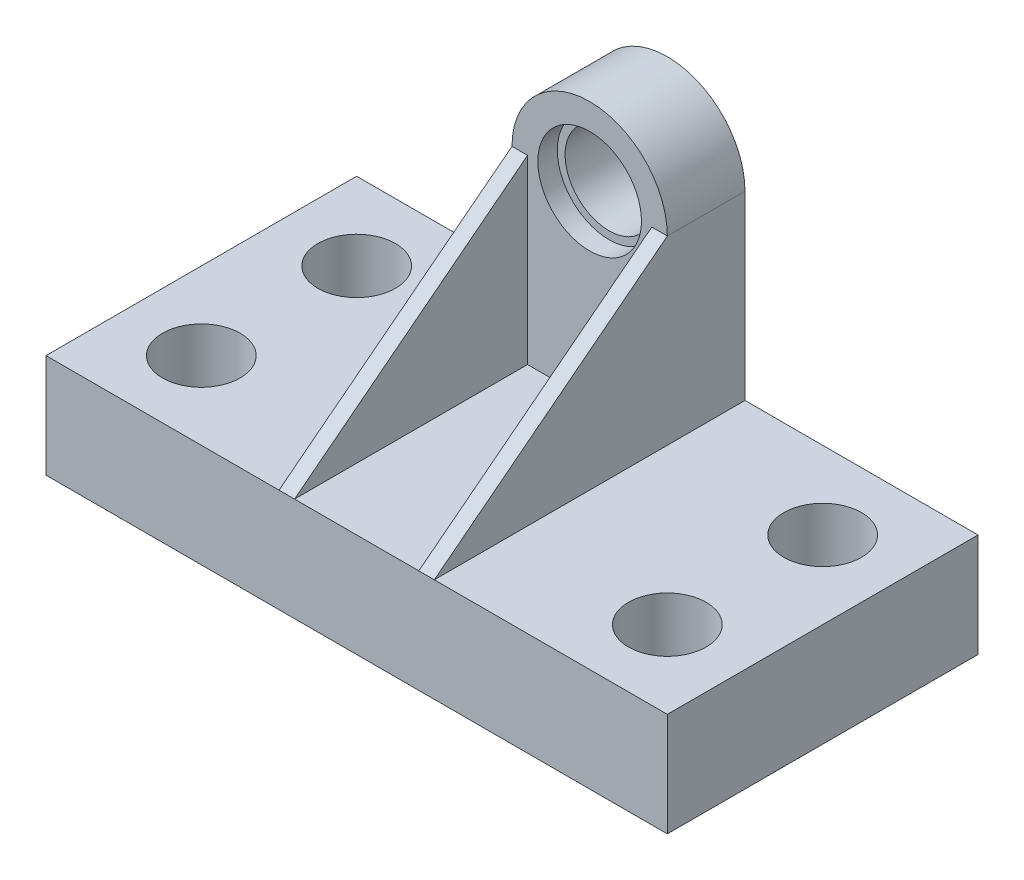
ISO-10303-21;
HEADER;
FILE_DESCRIPTION(('STEP AP214'),'2;1');
FILE_NAME('part.step','',(''),(''),'','','');
FILE_SCHEMA(('AUTOMOTIVE_DESIGN { 1 0 10303 214 1 1 1 1 }'));
ENDSEC;
DATA;
#1=APPLICATION_CONTEXT('core data for automotive mechanical design processes');
#2=APPLICATION_PROTOCOL_DEFINITION('international standard','automotive_design',2000,#1);
#3=PRODUCT_CONTEXT('',#1,'mechanical');
#4=PRODUCT('Part','Part','',(#3));
#5=PRODUCT_RELATED_PRODUCT_CATEGORY('part','',(#4));
#6=PRODUCT_DEFINITION_FORMATION('','',#4);
#7=PRODUCT_DEFINITION_CONTEXT('part definition',#1,'design');
#8=PRODUCT_DEFINITION('design','',#6,#7);
#9=PRODUCT_DEFINITION_SHAPE('','',#8);
#10=(LENGTH_UNIT() NAMED_UNIT(*) SI_UNIT(.MILLI.,.METRE.));
#11=(NAMED_UNIT(*) PLANE_ANGLE_UNIT() SI_UNIT($,.RADIAN.));
#12=(NAMED_UNIT(*) SI_UNIT($,.STERADIAN.) SOLID_ANGLE_UNIT());
#13=UNCERTAINTY_MEASURE_WITH_UNIT(LENGTH_MEASURE(1.E-05),#10,'distance_accuracy_value','');
#14=(GEOMETRIC_REPRESENTATION_CONTEXT(3) GLOBAL_UNCERTAINTY_ASSIGNED_CONTEXT((#13)) GLOBAL_UNIT_ASSIGNED_CONTEXT((#10,
#11,#12)) REPRESENTATION_CONTEXT('',''));
#15=CARTESIAN_POINT('',(0.,0.,0.));
#16=DIRECTION('',(0.,0.,1.));
#17=DIRECTION('',(1.,0.,0.));
#18=AXIS2_PLACEMENT_3D('',#15,#16,#17);
#19=CARTESIAN_POINT('',(0.,-533.4,0.));
#20=DIRECTION('',(0.,1.,0.));
#21=DIRECTION('',(0.,0.,1.));
#22=AXIS2_PLACEMENT_3D('',#19,#20,#21);
#23=PLANE('',#22);
#24=DIRECTION('',(1.,0.,0.));
#25=VECTOR('',#24,1.);
#26=CARTESIAN_POINT('',(-228.6,-533.4,228.6));
#27=LINE('',#26,#25);
#28=CARTESIAN_POINT('',(-182.88,-533.4,228.6));
#29=VERTEX_POINT('',#28);
#30=CARTESIAN_POINT('',(182.88,-533.4,228.6));
#31=VERTEX_POINT('',#30);
#32=EDGE_CURVE('E148',#29,#31,#27,.T.);
#33=ORIENTED_EDGE('',*,*,#32,.F.);
#34=DIRECTION('',(0.,0.,1.));
#35=VECTOR('',#34,1.);
#36=CARTESIAN_POINT('',(-182.88,-533.4,0.));
#37=LINE('',#36,#35);
#38=CARTESIAN_POINT('',(-182.88,-533.4,914.4));
#39=VERTEX_POINT('',#38);
#40=EDGE_CURVE('E131',#29,#39,#37,.T.);
#41=ORIENTED_EDGE('',*,*,#40,.T.);
#42=DIRECTION('',(-1.,0.,0.));
#43=VECTOR('',#42,1.);
#44=CARTESIAN_POINT('',(-914.4,-533.4,914.4));
#45=LINE('',#44,#43);
#46=CARTESIAN_POINT('',(182.88,-533.4,914.4));
#47=VERTEX_POINT('',#46);
#48=EDGE_CURVE('E272',#47,#39,#45,.T.);
#49=ORIENTED_EDGE('',*,*,#48,.F.);
#50=DIRECTION('',(0.,0.,-1.));
#51=VECTOR('',#50,1.);
#52=CARTESIAN_POINT('',(182.88,-533.4,0.));
#53=LINE('',#52,#51);
#54=EDGE_CURVE('E290',#47,#31,#53,.T.);
#55=ORIENTED_EDGE('',*,*,#54,.T.);
#56=EDGE_LOOP('',(#33,#41,#49,#55));
#57=FACE_BOUND('',#56,.T.);
#58=ADVANCED_FACE('F37',(#57),#23,.T.);
#59=CARTESIAN_POINT('',(0.,0.,228.6));
#60=DIRECTION('',(0.,0.,1.));
#61=DIRECTION('',(1.,0.,0.));
#62=AXIS2_PLACEMENT_3D('',#59,#60,#61);
#63=PLANE('',#62);
#64=DIRECTION('',(-1.,0.,0.));
#65=VECTOR('',#64,1.);
#66=CARTESIAN_POINT('',(-228.6,0.,228.6));
#67=LINE('',#66,#65);
#68=CARTESIAN_POINT('',(-182.88,0.,228.6));
#69=VERTEX_POINT('',#68);
#70=CARTESIAN_POINT('',(-228.6,0.,228.6));
#71=VERTEX_POINT('',#70);
#72=EDGE_CURVE('E122',#69,#71,#67,.T.);
#73=ORIENTED_EDGE('',*,*,#72,.F.);
#74=DIRECTION('',(0.,-1.,0.));
#75=VECTOR('',#74,1.);
#76=CARTESIAN_POINT('',(-182.88,-304.8,228.6));
#77=LINE('',#76,#75);
#78=EDGE_CURVE('E136',#29,#69,#77,.F.);
#79=ORIENTED_EDGE('',*,*,#78,.F.);
#80=ORIENTED_EDGE('',*,*,#32,.T.);
#81=DIRECTION('',(0.,1.,0.));
#82=VECTOR('',#81,1.);
#83=CARTESIAN_POINT('',(182.88,-304.8,228.6));
#84=LINE('',#83,#82);
#85=CARTESIAN_POINT('',(182.88,0.,228.6));
#86=VERTEX_POINT('',#85);
#87=EDGE_CURVE('E273',#31,#86,#84,.T.);
#88=ORIENTED_EDGE('',*,*,#87,.T.);
#89=DIRECTION('',(1.,0.,0.));
#90=VECTOR('',#89,1.);
#91=CARTESIAN_POINT('',(228.6,0.,228.6));
#92=LINE('',#91,#90);
#93=CARTESIAN_POINT('',(228.6,0.,228.6));
#94=VERTEX_POINT('',#93);
#95=EDGE_CURVE('E144',#86,#94,#92,.T.);
#96=ORIENTED_EDGE('',*,*,#95,.T.);
#97=CARTESIAN_POINT('',(0.,0.,228.6));
#98=DIRECTION('',(0.,0.,1.));
#99=DIRECTION('',(1.,0.,0.));
#100=AXIS2_PLACEMENT_3D('',#97,#98,#99);
#101=CIRCLE('',#100,228.6);
#102=EDGE_CURVE('E140',#94,#71,#101,.T.);
#103=ORIENTED_EDGE('',*,*,#102,.T.);
#104=EDGE_LOOP('',(#73,#79,#80,#88,#96,#103));
#105=FACE_BOUND('',#104,.T.);
#106=CARTESIAN_POINT('',(0.,0.,228.6));
#107=DIRECTION('',(0.,0.,1.));
#108=DIRECTION('',(1.,0.,0.));
#109=AXIS2_PLACEMENT_3D('',#106,#107,#108);
#110=CIRCLE('',#109,152.4);
#111=CARTESIAN_POINT('',(-152.4,0.,228.6));
#112=VERTEX_POINT('',#111);
#113=EDGE_CURVE('E41',#112,#112,#110,.F.);
#114=ORIENTED_EDGE('',*,*,#113,.T.);
#115=EDGE_LOOP('',(#114));
#116=FACE_BOUND('',#115,.T.);
#117=ADVANCED_FACE('F141',(#105,#116),#63,.T.);
#118=CARTESIAN_POINT('',(-685.8,-533.4,228.6));
#119=DIRECTION('',(0.,1.,0.));
#120=DIRECTION('',(0.,0.,1.));
#121=AXIS2_PLACEMENT_3D('',#118,#119,#120);
#122=CIRCLE('',#121,114.3);
#123=CARTESIAN_POINT('',(-685.8,-533.4,342.9));
#124=VERTEX_POINT('',#123);
#125=EDGE_CURVE('E309',#124,#124,#122,.T.);
#126=ORIENTED_EDGE('',*,*,#125,.F.);
#127=EDGE_LOOP('',(#126));
#128=FACE_BOUND('',#127,.T.);
#129=CARTESIAN_POINT('',(-685.8,-533.4,685.800000000001));
#130=DIRECTION('',(0.,1.,0.));
#131=DIRECTION('',(0.,0.,1.));
#132=AXIS2_PLACEMENT_3D('',#129,#130,#131);
#133=CIRCLE('',#132,114.3);
#134=CARTESIAN_POINT('',(-685.8,-533.4,800.100000000001));
#135=VERTEX_POINT('',#134);
#136=EDGE_CURVE('E302',#135,#135,#133,.T.);
#137=ORIENTED_EDGE('',*,*,#136,.F.);
#138=EDGE_LOOP('',(#137));
#139=FACE_BOUND('',#138,.T.);
#140=CARTESIAN_POINT('',(-228.6,-533.4,914.4));
#141=VERTEX_POINT('',#140);
#142=CARTESIAN_POINT('',(-914.4,-533.4,914.4));
#143=VERTEX_POINT('',#142);
#144=EDGE_CURVE('E173',#141,#143,#45,.T.);
#145=ORIENTED_EDGE('',*,*,#144,.F.);
#146=DIRECTION('',(0.,0.,-1.));
#147=VECTOR('',#146,1.);
#148=CARTESIAN_POINT('',(-228.6,-533.4,228.6));
#149=LINE('',#148,#147);
#150=CARTESIAN_POINT('',(-228.6,-533.4,1.25979416228288E-13));
#151=VERTEX_POINT('',#150);
#152=EDGE_CURVE('E46',#141,#151,#149,.T.);
#153=ORIENTED_EDGE('',*,*,#152,.T.);
#154=DIRECTION('',(1.,0.,0.));
#155=VECTOR('',#154,1.);
#156=CARTESIAN_POINT('',(-914.4,-533.4,0.));
#157=LINE('',#156,#155);
#158=CARTESIAN_POINT('',(-914.4,-533.4,0.));
#159=VERTEX_POINT('',#158);
#160=EDGE_CURVE('E171',#159,#151,#157,.T.);
#161=ORIENTED_EDGE('',*,*,#160,.F.);
#162=DIRECTION('',(0.,0.,-1.));
#163=VECTOR('',#162,1.);
#164=CARTESIAN_POINT('',(-914.4,-533.4,0.));
#165=LINE('',#164,#163);
#166=EDGE_CURVE('E183',#143,#159,#165,.T.);
#167=ORIENTED_EDGE('',*,*,#166,.F.);
#168=EDGE_LOOP('',(#145,#153,#161,#167));
#169=FACE_BOUND('',#168,.T.);
#170=ADVANCED_FACE('F169',(#128,#139,#169),#23,.T.);
#171=CARTESIAN_POINT('',(0.,0.,228.6));
#172=DIRECTION('',(0.,0.,-1.));
#173=DIRECTION('',(-1.,0.,0.));
#174=AXIS2_PLACEMENT_3D('',#171,#172,#173);
#175=CYLINDRICAL_SURFACE('',#174,228.6);
#176=CARTESIAN_POINT('',(0.,0.,0.));
#177=DIRECTION('',(0.,0.,1.));
#178=DIRECTION('',(1.,0.,0.));
#179=AXIS2_PLACEMENT_3D('',#176,#177,#178);
#180=CIRCLE('',#179,228.6);
#181=CARTESIAN_POINT('',(228.6,0.,0.));
#182=VERTEX_POINT('',#181);
#183=CARTESIAN_POINT('',(-228.6,0.,0.));
#184=VERTEX_POINT('',#183);
#185=EDGE_CURVE('E152',#182,#184,#180,.T.);
#186=ORIENTED_EDGE('',*,*,#185,.T.);
#187=DIRECTION('',(0.,0.,-1.));
#188=VECTOR('',#187,1.);
#189=CARTESIAN_POINT('',(-228.6,0.,228.6));
#190=LINE('',#189,#188);
#191=EDGE_CURVE('E11',#71,#184,#190,.T.);
#192=ORIENTED_EDGE('',*,*,#191,.F.);
#193=ORIENTED_EDGE('',*,*,#102,.F.);
#194=DIRECTION('',(0.,0.,-1.));
#195=VECTOR('',#194,1.);
#196=CARTESIAN_POINT('',(228.6,0.,228.6));
#197=LINE('',#196,#195);
#198=EDGE_CURVE('E153',#94,#182,#197,.T.);
#199=ORIENTED_EDGE('',*,*,#198,.T.);
#200=EDGE_LOOP('',(#186,#192,#193,#199));
#201=FACE_BOUND('',#200,.T.);
#202=ADVANCED_FACE('F39',(#201),#175,.T.);
#203=CARTESIAN_POINT('',(-228.6,0.,228.6));
#204=DIRECTION('',(1.,0.,0.));
#205=DIRECTION('',(0.,1.,0.));
#206=AXIS2_PLACEMENT_3D('',#203,#204,#205);
#207=PLANE('',#206);
#208=DIRECTION('',(0.,-1.,0.));
#209=VECTOR('',#208,1.);
#210=CARTESIAN_POINT('',(-228.6,0.,0.));
#211=LINE('',#210,#209);
#212=EDGE_CURVE('E156',#184,#151,#211,.T.);
#213=ORIENTED_EDGE('',*,*,#212,.T.);
#214=ORIENTED_EDGE('',*,*,#152,.F.);
#215=DIRECTION('',(0.,-0.61394061351492,0.789352217376326));
#216=VECTOR('',#215,1.);
#217=CARTESIAN_POINT('',(-228.6,0.,228.6));
#218=LINE('',#217,#216);
#219=EDGE_CURVE('E124',#71,#141,#218,.T.);
#220=ORIENTED_EDGE('',*,*,#219,.F.);
#221=ORIENTED_EDGE('',*,*,#191,.T.);
#222=EDGE_LOOP('',(#213,#214,#220,#221));
#223=FACE_BOUND('',#222,.T.);
#224=ADVANCED_FACE('F133',(#223),#207,.F.);
#225=CARTESIAN_POINT('',(228.6,0.,228.6));
#226=DIRECTION('',(-1.,0.,0.));
#227=DIRECTION('',(0.,-1.,0.));
#228=AXIS2_PLACEMENT_3D('',#225,#226,#227);
#229=PLANE('',#228);
#230=DIRECTION('',(0.,1.,0.));
#231=VECTOR('',#230,1.);
#232=CARTESIAN_POINT('',(228.6,0.,0.));
#233=LINE('',#232,#231);
#234=CARTESIAN_POINT('',(228.6,-533.4,0.));
#235=VERTEX_POINT('',#234);
#236=EDGE_CURVE('E149',#235,#182,#233,.T.);
#237=ORIENTED_EDGE('',*,*,#236,.T.);
#238=ORIENTED_EDGE('',*,*,#198,.F.);
#239=DIRECTION('',(0.,-0.61394061351492,0.789352217376326));
#240=VECTOR('',#239,1.);
#241=CARTESIAN_POINT('',(228.6,0.,228.6));
#242=LINE('',#241,#240);
#243=CARTESIAN_POINT('',(228.6,-533.4,914.400000000001));
#244=VERTEX_POINT('',#243);
#245=EDGE_CURVE('E269',#94,#244,#242,.T.);
#246=ORIENTED_EDGE('',*,*,#245,.T.);
#247=DIRECTION('',(0.,0.,-1.));
#248=VECTOR('',#247,1.);
#249=CARTESIAN_POINT('',(228.6,-533.4,228.6));
#250=LINE('',#249,#248);
#251=EDGE_CURVE('E165',#244,#235,#250,.T.);
#252=ORIENTED_EDGE('',*,*,#251,.T.);
#253=EDGE_LOOP('',(#237,#238,#246,#252));
#254=FACE_BOUND('',#253,.T.);
#255=ADVANCED_FACE('F225',(#254),#229,.F.);
#256=CARTESIAN_POINT('',(0.,0.,0.));
#257=DIRECTION('',(0.,0.,1.));
#258=DIRECTION('',(1.,0.,0.));
#259=AXIS2_PLACEMENT_3D('',#256,#257,#258);
#260=PLANE('',#259);
#261=CARTESIAN_POINT('',(0.,0.,0.));
#262=DIRECTION('',(0.,0.,1.));
#263=DIRECTION('',(1.,0.,0.));
#264=AXIS2_PLACEMENT_3D('',#261,#262,#263);
#265=CIRCLE('',#264,129.54);
#266=CARTESIAN_POINT('',(129.54,0.,0.));
#267=VERTEX_POINT('',#266);
#268=EDGE_CURVE('E203',#267,#267,#265,.T.);
#269=ORIENTED_EDGE('',*,*,#268,.T.);
#270=EDGE_LOOP('',(#269));
#271=FACE_BOUND('',#270,.T.);
#272=ORIENTED_EDGE('',*,*,#185,.F.);
#273=ORIENTED_EDGE('',*,*,#236,.F.);
#274=CARTESIAN_POINT('',(914.4,-533.4,3.35945109942102E-13));
#275=VERTEX_POINT('',#274);
#276=EDGE_CURVE('E180',#235,#275,#157,.T.);
#277=ORIENTED_EDGE('',*,*,#276,.T.);
#278=DIRECTION('',(0.,1.,0.));
#279=VECTOR('',#278,1.);
#280=CARTESIAN_POINT('',(914.4,-838.2,3.35945109942102E-13));
#281=LINE('',#280,#279);
#282=CARTESIAN_POINT('',(914.4,-838.2,3.35945109942102E-13));
#283=VERTEX_POINT('',#282);
#284=EDGE_CURVE('E199',#283,#275,#281,.T.);
#285=ORIENTED_EDGE('',*,*,#284,.F.);
#286=DIRECTION('',(1.,0.,0.));
#287=VECTOR('',#286,1.);
#288=CARTESIAN_POINT('',(-914.4,-838.2,0.));
#289=LINE('',#288,#287);
#290=CARTESIAN_POINT('',(-914.4,-838.2,0.));
#291=VERTEX_POINT('',#290);
#292=EDGE_CURVE('E283',#291,#283,#289,.T.);
#293=ORIENTED_EDGE('',*,*,#292,.F.);
#294=DIRECTION('',(0.,1.,0.));
#295=VECTOR('',#294,1.);
#296=CARTESIAN_POINT('',(-914.4,-838.2,0.));
#297=LINE('',#296,#295);
#298=EDGE_CURVE('E177',#291,#159,#297,.T.);
#299=ORIENTED_EDGE('',*,*,#298,.T.);
#300=ORIENTED_EDGE('',*,*,#160,.T.);
#301=ORIENTED_EDGE('',*,*,#212,.F.);
#302=EDGE_LOOP('',(#272,#273,#277,#285,#293,#299,#300,#301));
#303=FACE_BOUND('',#302,.T.);
#304=ADVANCED_FACE('F175',(#271,#303),#260,.F.);
#305=CARTESIAN_POINT('',(0.,0.,228.600012));
#306=DIRECTION('',(0.,0.,-1.));
#307=DIRECTION('',(-1.,0.,0.));
#308=AXIS2_PLACEMENT_3D('',#305,#306,#307);
#309=CYLINDRICAL_SURFACE('',#308,152.4);
#310=CARTESIAN_POINT('',(0.,0.,171.45));
#311=DIRECTION('',(0.,0.,1.));
#312=DIRECTION('',(1.,0.,0.));
#313=AXIS2_PLACEMENT_3D('',#310,#311,#312);
#314=CIRCLE('',#313,152.4);
#315=CARTESIAN_POINT('',(-152.4,0.,171.45));
#316=VERTEX_POINT('',#315);
#317=EDGE_CURVE('E160',#316,#316,#314,.T.);
#318=CARTESIAN_POINT('',(-152.4,0.,228.6));
#319=CARTESIAN_POINT('',(-152.4,0.,228.0046875));
#320=CARTESIAN_POINT('',(-152.4,0.,227.409375));
#321=CARTESIAN_POINT('',(-152.4,0.,226.21875));
#322=CARTESIAN_POINT('',(-152.4,0.,225.6234375));
#323=CARTESIAN_POINT('',(-152.4,0.,224.4328125));
#324=CARTESIAN_POINT('',(-152.4,0.,223.8375));
#325=CARTESIAN_POINT('',(-152.4,0.,222.646875));
#326=CARTESIAN_POINT('',(-152.4,0.,222.0515625));
#327=CARTESIAN_POINT('',(-152.4,0.,220.8609375));
#328=CARTESIAN_POINT('',(-152.4,0.,220.265625));
#329=CARTESIAN_POINT('',(-152.4,0.,219.075));
#330=CARTESIAN_POINT('',(-152.4,0.,218.4796875));
#331=CARTESIAN_POINT('',(-152.4,0.,217.2890625));
#332=CARTESIAN_POINT('',(-152.4,0.,216.69375));
#333=CARTESIAN_POINT('',(-152.4,0.,215.503125));
#334=CARTESIAN_POINT('',(-152.4,0.,214.9078125));
#335=CARTESIAN_POINT('',(-152.4,0.,213.7171875));
#336=CARTESIAN_POINT('',(-152.4,0.,213.121875));
#337=CARTESIAN_POINT('',(-152.4,0.,211.93125));
#338=CARTESIAN_POINT('',(-152.4,0.,211.3359375));
#339=CARTESIAN_POINT('',(-152.4,0.,210.1453125));
#340=CARTESIAN_POINT('',(-152.4,0.,209.55));
#341=CARTESIAN_POINT('',(-152.4,0.,208.359375));
#342=CARTESIAN_POINT('',(-152.4,0.,207.7640625));
#343=CARTESIAN_POINT('',(-152.4,0.,206.5734375));
#344=CARTESIAN_POINT('',(-152.4,0.,205.978125));
#345=CARTESIAN_POINT('',(-152.4,0.,204.7875));
#346=CARTESIAN_POINT('',(-152.4,0.,204.1921875));
#347=CARTESIAN_POINT('',(-152.4,0.,203.0015625));
#348=CARTESIAN_POINT('',(-152.4,0.,202.40625));
#349=CARTESIAN_POINT('',(-152.4,0.,201.215625));
#350=CARTESIAN_POINT('',(-152.4,0.,200.6203125));
#351=CARTESIAN_POINT('',(-152.4,0.,199.4296875));
#352=CARTESIAN_POINT('',(-152.4,0.,198.834375));
#353=CARTESIAN_POINT('',(-152.4,0.,197.64375));
#354=CARTESIAN_POINT('',(-152.4,0.,197.0484375));
#355=CARTESIAN_POINT('',(-152.4,0.,195.8578125));
#356=CARTESIAN_POINT('',(-152.4,0.,195.2625));
#357=CARTESIAN_POINT('',(-152.4,0.,194.071875));
#358=CARTESIAN_POINT('',(-152.4,0.,193.4765625));
#359=CARTESIAN_POINT('',(-152.4,0.,192.2859375));
#360=CARTESIAN_POINT('',(-152.4,0.,191.690625));
#361=CARTESIAN_POINT('',(-152.4,0.,190.5));
#362=CARTESIAN_POINT('',(-152.4,0.,189.9046875));
#363=CARTESIAN_POINT('',(-152.4,0.,188.7140625));
#364=CARTESIAN_POINT('',(-152.4,0.,188.11875));
#365=CARTESIAN_POINT('',(-152.4,0.,186.928125));
#366=CARTESIAN_POINT('',(-152.4,0.,186.3328125));
#367=CARTESIAN_POINT('',(-152.4,0.,185.1421875));
#368=CARTESIAN_POINT('',(-152.4,0.,184.546875));
#369=CARTESIAN_POINT('',(-152.4,0.,183.35625));
#370=CARTESIAN_POINT('',(-152.4,0.,182.7609375));
#371=CARTESIAN_POINT('',(-152.4,0.,181.5703125));
#372=CARTESIAN_POINT('',(-152.4,0.,180.975));
#373=CARTESIAN_POINT('',(-152.4,0.,179.784375));
#374=CARTESIAN_POINT('',(-152.4,0.,179.1890625));
#375=CARTESIAN_POINT('',(-152.4,0.,177.9984375));
#376=CARTESIAN_POINT('',(-152.4,0.,177.403125));
#377=CARTESIAN_POINT('',(-152.4,0.,176.2125));
#378=CARTESIAN_POINT('',(-152.4,0.,175.6171875));
#379=CARTESIAN_POINT('',(-152.4,0.,174.4265625));
#380=CARTESIAN_POINT('',(-152.4,0.,173.83125));
#381=CARTESIAN_POINT('',(-152.4,0.,172.640625));
#382=CARTESIAN_POINT('',(-152.4,0.,172.0453125));
#383=CARTESIAN_POINT('',(-152.4,0.,171.45));
#384=B_SPLINE_CURVE_WITH_KNOTS('',3,(#318,#319,#320,#321,#322,#323,#324,#325,#326,#327,#328,
#329,#330,#331,#332,#333,#334,#335,#336,#337,#338,#339,#340,#341,#342,#343,#344,#345,#346,#347,
#348,#349,#350,#351,#352,#353,#354,#355,#356,#357,#358,#359,#360,#361,#362,#363,#364,#365,#366,
#367,#368,#369,#370,#371,#372,#373,#374,#375,#376,#377,#378,#379,#380,#381,#382,#383),
.UNSPECIFIED.,.F.,.F.,(4,2,2,2,2,2,2,2,2,2,2,2,2,2,2,2,2,2,2,2,2,2,2,2,2,2,2,2,2,2,2,2,4),(0.,
1.78593749999997,3.57187499999997,5.35781249999998,7.14374999999998,8.92968749999998,10.715625,
12.5015625,14.2875,16.0734375,17.859375,19.6453125,21.43125,23.2171875,25.003125,26.7890625,
28.575,30.3609375,32.146875,33.9328125,35.71875,37.5046875,39.290625,41.0765625,42.8625,
44.6484375,46.434375,48.2203125,50.00625,51.7921875,53.578125,55.3640625,57.15),.UNSPECIFIED.);
#385=EDGE_CURVE('BSEAM214',#112,#316,#384,.T.);
#386=ORIENTED_EDGE('',*,*,#113,.F.);
#387=ORIENTED_EDGE('',*,*,#317,.F.);
#388=ORIENTED_EDGE('',*,*,#385,.T.);
#389=ORIENTED_EDGE('',*,*,#385,.F.);
#390=EDGE_LOOP('',(#386,#388,#387,#389));
#391=FACE_BOUND('',#390,.T.);
#392=ADVANCED_FACE('F214',(#391),#309,.F.);
#393=CARTESIAN_POINT('',(0.,0.,171.45));
#394=DIRECTION('',(0.,0.,1.));
#395=DIRECTION('',(1.,0.,0.));
#396=AXIS2_PLACEMENT_3D('',#393,#394,#395);
#397=PLANE('',#396);
#398=CARTESIAN_POINT('',(0.,0.,171.45));
#399=DIRECTION('',(0.,0.,1.));
#400=DIRECTION('',(1.,0.,0.));
#401=AXIS2_PLACEMENT_3D('',#398,#399,#400);
#402=CIRCLE('',#401,129.54);
#403=CARTESIAN_POINT('',(129.54,0.,171.45));
#404=VERTEX_POINT('',#403);
#405=EDGE_CURVE('E206',#404,#404,#402,.T.);
#406=ORIENTED_EDGE('',*,*,#405,.F.);
#407=EDGE_LOOP('',(#406));
#408=FACE_BOUND('',#407,.T.);
#409=ORIENTED_EDGE('',*,*,#317,.T.);
#410=EDGE_LOOP('',(#409));
#411=FACE_BOUND('',#410,.T.);
#412=ADVANCED_FACE('F212',(#408,#411),#397,.T.);
#413=CARTESIAN_POINT('',(0.,0.,0.));
#414=DIRECTION('',(0.,0.,1.));
#415=DIRECTION('',(1.,0.,0.));
#416=AXIS2_PLACEMENT_3D('',#413,#414,#415);
#417=CYLINDRICAL_SURFACE('',#416,129.54);
#418=CARTESIAN_POINT('',(129.54,0.,171.45));
#419=CARTESIAN_POINT('',(129.54,0.,169.6640625));
#420=CARTESIAN_POINT('',(129.54,0.,167.878125));
#421=CARTESIAN_POINT('',(129.54,0.,164.30625));
#422=CARTESIAN_POINT('',(129.54,0.,162.5203125));
#423=CARTESIAN_POINT('',(129.54,0.,158.9484375));
#424=CARTESIAN_POINT('',(129.54,0.,157.1625));
#425=CARTESIAN_POINT('',(129.54,0.,153.590625));
#426=CARTESIAN_POINT('',(129.54,0.,151.8046875));
#427=CARTESIAN_POINT('',(129.54,0.,148.2328125));
#428=CARTESIAN_POINT('',(129.54,0.,146.446875));
#429=CARTESIAN_POINT('',(129.54,0.,142.875));
#430=CARTESIAN_POINT('',(129.54,0.,141.0890625));
#431=CARTESIAN_POINT('',(129.54,0.,137.5171875));
#432=CARTESIAN_POINT('',(129.54,0.,135.73125));
#433=CARTESIAN_POINT('',(129.54,0.,132.159375));
#434=CARTESIAN_POINT('',(129.54,0.,130.3734375));
#435=CARTESIAN_POINT('',(129.54,0.,126.8015625));
#436=CARTESIAN_POINT('',(129.54,0.,125.015625));
#437=CARTESIAN_POINT('',(129.54,0.,121.44375));
#438=CARTESIAN_POINT('',(129.54,0.,119.6578125));
#439=CARTESIAN_POINT('',(129.54,0.,116.0859375));
#440=CARTESIAN_POINT('',(129.54,0.,114.3));
#441=CARTESIAN_POINT('',(129.54,0.,110.728125));
#442=CARTESIAN_POINT('',(129.54,0.,108.9421875));
#443=CARTESIAN_POINT('',(129.54,0.,105.3703125));
#444=CARTESIAN_POINT('',(129.54,0.,103.584375));
#445=CARTESIAN_POINT('',(129.54,0.,100.0125));
#446=CARTESIAN_POINT('',(129.54,0.,98.2265625));
#447=CARTESIAN_POINT('',(129.54,0.,94.6546875));
#448=CARTESIAN_POINT('',(129.54,0.,92.86875));
#449=CARTESIAN_POINT('',(129.54,0.,89.296875));
#450=CARTESIAN_POINT('',(129.54,0.,87.5109375));
#451=CARTESIAN_POINT('',(129.54,0.,83.9390625));
#452=CARTESIAN_POINT('',(129.54,0.,82.153125));
#453=CARTESIAN_POINT('',(129.54,0.,78.58125));
#454=CARTESIAN_POINT('',(129.54,0.,76.7953125));
#455=CARTESIAN_POINT('',(129.54,0.,73.2234375));
#456=CARTESIAN_POINT('',(129.54,0.,71.4375));
#457=CARTESIAN_POINT('',(129.54,0.,67.865625));
#458=CARTESIAN_POINT('',(129.54,0.,66.0796875));
#459=CARTESIAN_POINT('',(129.54,0.,62.5078125));
#460=CARTESIAN_POINT('',(129.54,0.,60.721875));
#461=CARTESIAN_POINT('',(129.54,0.,57.15));
#462=CARTESIAN_POINT('',(129.54,0.,55.3640625));
#463=CARTESIAN_POINT('',(129.54,0.,51.7921875));
#464=CARTESIAN_POINT('',(129.54,0.,50.00625));
#465=CARTESIAN_POINT('',(129.54,0.,46.434375));
#466=CARTESIAN_POINT('',(129.54,0.,44.6484375));
#467=CARTESIAN_POINT('',(129.54,0.,41.0765625));
#468=CARTESIAN_POINT('',(129.54,0.,39.290625));
#469=CARTESIAN_POINT('',(129.54,0.,35.71875));
#470=CARTESIAN_POINT('',(129.54,0.,33.9328125));
#471=CARTESIAN_POINT('',(129.54,0.,30.3609375));
#472=CARTESIAN_POINT('',(129.54,0.,28.575));
#473=CARTESIAN_POINT('',(129.54,0.,25.003125));
#474=CARTESIAN_POINT('',(129.54,0.,23.2171875));
#475=CARTESIAN_POINT('',(129.54,0.,19.6453125));
#476=CARTESIAN_POINT('',(129.54,0.,17.859375));
#477=CARTESIAN_POINT('',(129.54,0.,14.2875));
#478=CARTESIAN_POINT('',(129.54,0.,12.5015625));
#479=CARTESIAN_POINT('',(129.54,0.,8.9296875));
#480=CARTESIAN_POINT('',(129.54,0.,7.14375));
#481=CARTESIAN_POINT('',(129.54,0.,3.571875));
#482=CARTESIAN_POINT('',(129.54,0.,1.7859375));
#483=CARTESIAN_POINT('',(129.54,0.,0.));
#484=B_SPLINE_CURVE_WITH_KNOTS('',3,(#418,#419,#420,#421,#422,#423,#424,#425,#426,#427,#428,
#429,#430,#431,#432,#433,#434,#435,#436,#437,#438,#439,#440,#441,#442,#443,#444,#445,#446,#447,
#448,#449,#450,#451,#452,#453,#454,#455,#456,#457,#458,#459,#460,#461,#462,#463,#464,#465,#466,
#467,#468,#469,#470,#471,#472,#473,#474,#475,#476,#477,#478,#479,#480,#481,#482,#483),
.UNSPECIFIED.,.F.,.F.,(4,2,2,2,2,2,2,2,2,2,2,2,2,2,2,2,2,2,2,2,2,2,2,2,2,2,2,2,2,2,2,2,4),(0.,
5.3578125,10.715625,16.0734375,21.43125,26.7890625,32.146875,37.5046875,42.8625,48.2203125,
53.578125,58.9359375,64.29375,69.6515625,75.009375,80.3671875,85.725,91.0828125,96.440625,
101.7984375,107.15625,112.5140625,117.871875,123.2296875,128.5875,133.9453125,139.303125,
144.6609375,150.01875,155.3765625,160.734375,166.0921875,171.45),.UNSPECIFIED.);
#485=EDGE_CURVE('BSEAM222',#404,#267,#484,.T.);
#486=ORIENTED_EDGE('',*,*,#405,.T.);
#487=ORIENTED_EDGE('',*,*,#268,.F.);
#488=ORIENTED_EDGE('',*,*,#485,.T.);
#489=ORIENTED_EDGE('',*,*,#485,.F.);
#490=EDGE_LOOP('',(#486,#488,#487,#489));
#491=FACE_BOUND('',#490,.T.);
#492=ADVANCED_FACE('F222',(#491),#417,.F.);
#493=CARTESIAN_POINT('',(685.8,-533.4,228.6));
#494=DIRECTION('',(0.,1.,0.));
#495=DIRECTION('',(0.,0.,1.));
#496=AXIS2_PLACEMENT_3D('',#493,#494,#495);
#497=CIRCLE('',#496,114.3);
#498=CARTESIAN_POINT('',(685.8,-533.4,342.9));
#499=VERTEX_POINT('',#498);
#500=EDGE_CURVE('E257',#499,#499,#497,.T.);
#501=ORIENTED_EDGE('',*,*,#500,.F.);
#502=EDGE_LOOP('',(#501));
#503=FACE_BOUND('',#502,.T.);
#504=CARTESIAN_POINT('',(685.8,-533.4,685.800000000001));
#505=DIRECTION('',(0.,1.,0.));
#506=DIRECTION('',(0.,0.,1.));
#507=AXIS2_PLACEMENT_3D('',#504,#505,#506);
#508=CIRCLE('',#507,114.3);
#509=CARTESIAN_POINT('',(685.8,-533.4,800.100000000001));
#510=VERTEX_POINT('',#509);
#511=EDGE_CURVE('E261',#510,#510,#508,.T.);
#512=ORIENTED_EDGE('',*,*,#511,.F.);
#513=EDGE_LOOP('',(#512));
#514=FACE_BOUND('',#513,.T.);
#515=ORIENTED_EDGE('',*,*,#251,.F.);
#516=CARTESIAN_POINT('',(914.4,-533.4,914.400000000001));
#517=VERTEX_POINT('',#516);
#518=EDGE_CURVE('E187',#517,#244,#45,.T.);
#519=ORIENTED_EDGE('',*,*,#518,.F.);
#520=DIRECTION('',(0.,0.,1.));
#521=VECTOR('',#520,1.);
#522=CARTESIAN_POINT('',(914.4,-533.4,3.35945109942102E-13));
#523=LINE('',#522,#521);
#524=EDGE_CURVE('E179',#275,#517,#523,.T.);
#525=ORIENTED_EDGE('',*,*,#524,.F.);
#526=ORIENTED_EDGE('',*,*,#276,.F.);
#527=EDGE_LOOP('',(#515,#519,#525,#526));
#528=FACE_BOUND('',#527,.T.);
#529=ADVANCED_FACE('F233',(#503,#514,#528),#23,.T.);
#530=CARTESIAN_POINT('',(-914.4,-838.2,0.));
#531=DIRECTION('',(1.,0.,0.));
#532=DIRECTION('',(0.,0.,-1.));
#533=AXIS2_PLACEMENT_3D('',#530,#531,#532);
#534=PLANE('',#533);
#535=ORIENTED_EDGE('',*,*,#166,.T.);
#536=ORIENTED_EDGE('',*,*,#298,.F.);
#537=DIRECTION('',(0.,0.,-1.));
#538=VECTOR('',#537,1.);
#539=CARTESIAN_POINT('',(-914.4,-838.2,0.));
#540=LINE('',#539,#538);
#541=CARTESIAN_POINT('',(-914.4,-838.2,914.4));
#542=VERTEX_POINT('',#541);
#543=EDGE_CURVE('E190',#542,#291,#540,.T.);
#544=ORIENTED_EDGE('',*,*,#543,.F.);
#545=DIRECTION('',(0.,1.,0.));
#546=VECTOR('',#545,1.);
#547=CARTESIAN_POINT('',(-914.4,-838.2,914.4));
#548=LINE('',#547,#546);
#549=EDGE_CURVE('E192',#542,#143,#548,.T.);
#550=ORIENTED_EDGE('',*,*,#549,.T.);
#551=EDGE_LOOP('',(#535,#536,#544,#550));
#552=FACE_BOUND('',#551,.T.);
#553=ADVANCED_FACE('F243',(#552),#534,.F.);
#554=CARTESIAN_POINT('',(914.4,-838.2,3.35945109942102E-13));
#555=DIRECTION('',(-1.,0.,0.));
#556=DIRECTION('',(0.,0.,1.));
#557=AXIS2_PLACEMENT_3D('',#554,#555,#556);
#558=PLANE('',#557);
#559=ORIENTED_EDGE('',*,*,#524,.T.);
#560=DIRECTION('',(0.,1.,0.));
#561=VECTOR('',#560,1.);
#562=CARTESIAN_POINT('',(914.4,-838.2,914.400000000001));
#563=LINE('',#562,#561);
#564=CARTESIAN_POINT('',(914.4,-838.2,914.400000000001));
#565=VERTEX_POINT('',#564);
#566=EDGE_CURVE('E195',#565,#517,#563,.T.);
#567=ORIENTED_EDGE('',*,*,#566,.F.);
#568=DIRECTION('',(0.,0.,1.));
#569=VECTOR('',#568,1.);
#570=CARTESIAN_POINT('',(914.4,-838.2,3.35945109942102E-13));
#571=LINE('',#570,#569);
#572=EDGE_CURVE('E281',#283,#565,#571,.T.);
#573=ORIENTED_EDGE('',*,*,#572,.F.);
#574=ORIENTED_EDGE('',*,*,#284,.T.);
#575=EDGE_LOOP('',(#559,#567,#573,#574));
#576=FACE_BOUND('',#575,.T.);
#577=ADVANCED_FACE('F249',(#576),#558,.F.);
#578=CARTESIAN_POINT('',(-914.4,-838.2,914.4));
#579=DIRECTION('',(0.,0.,-1.));
#580=DIRECTION('',(-1.,0.,0.));
#581=AXIS2_PLACEMENT_3D('',#578,#579,#580);
#582=PLANE('',#581);
#583=ORIENTED_EDGE('',*,*,#549,.F.);
#584=DIRECTION('',(-1.,0.,0.));
#585=VECTOR('',#584,1.);
#586=CARTESIAN_POINT('',(-914.4,-838.2,914.4));
#587=LINE('',#586,#585);
#588=EDGE_CURVE('E196',#565,#542,#587,.T.);
#589=ORIENTED_EDGE('',*,*,#588,.F.);
#590=ORIENTED_EDGE('',*,*,#566,.T.);
#591=ORIENTED_EDGE('',*,*,#518,.T.);
#592=EDGE_CURVE('E191',#244,#47,#45,.T.);
#593=ORIENTED_EDGE('',*,*,#592,.T.);
#594=ORIENTED_EDGE('',*,*,#48,.T.);
#595=EDGE_CURVE('E514',#39,#141,#45,.T.);
#596=ORIENTED_EDGE('',*,*,#595,.T.);
#597=ORIENTED_EDGE('',*,*,#144,.T.);
#598=EDGE_LOOP('',(#583,#589,#590,#591,#593,#594,#596,#597));
#599=FACE_BOUND('',#598,.T.);
#600=ADVANCED_FACE('F276',(#599),#582,.F.);
#601=CARTESIAN_POINT('',(0.,-838.2,0.));
#602=DIRECTION('',(0.,1.,0.));
#603=DIRECTION('',(0.,0.,1.));
#604=AXIS2_PLACEMENT_3D('',#601,#602,#603);
#605=PLANE('',#604);
#606=CARTESIAN_POINT('',(-685.8,-838.2,228.6));
#607=DIRECTION('',(0.,-1.,0.));
#608=DIRECTION('',(0.,0.,1.));
#609=AXIS2_PLACEMENT_3D('',#606,#607,#608);
#610=CIRCLE('',#609,114.3);
#611=CARTESIAN_POINT('',(-685.8,-838.2,342.9));
#612=VERTEX_POINT('',#611);
#613=EDGE_CURVE('E314',#612,#612,#610,.T.);
#614=ORIENTED_EDGE('',*,*,#613,.F.);
#615=EDGE_LOOP('',(#614));
#616=FACE_BOUND('',#615,.T.);
#617=CARTESIAN_POINT('',(685.8,-838.2,228.6));
#618=DIRECTION('',(0.,-1.,0.));
#619=DIRECTION('',(0.,0.,-1.));
#620=AXIS2_PLACEMENT_3D('',#617,#618,#619);
#621=CIRCLE('',#620,114.3);
#622=CARTESIAN_POINT('',(685.8,-838.2,114.3));
#623=VERTEX_POINT('',#622);
#624=EDGE_CURVE('E318',#623,#623,#621,.T.);
#625=ORIENTED_EDGE('',*,*,#624,.F.);
#626=EDGE_LOOP('',(#625));
#627=FACE_BOUND('',#626,.T.);
#628=CARTESIAN_POINT('',(685.8,-838.2,685.800000000001));
#629=DIRECTION('',(0.,-1.,0.));
#630=DIRECTION('',(0.,0.,1.));
#631=AXIS2_PLACEMENT_3D('',#628,#629,#630);
#632=CIRCLE('',#631,114.3);
#633=CARTESIAN_POINT('',(685.8,-838.2,800.100000000001));
#634=VERTEX_POINT('',#633);
#635=EDGE_CURVE('E315',#634,#634,#632,.T.);
#636=ORIENTED_EDGE('',*,*,#635,.F.);
#637=EDGE_LOOP('',(#636));
#638=FACE_BOUND('',#637,.T.);
#639=CARTESIAN_POINT('',(-685.8,-838.2,685.800000000001));
#640=DIRECTION('',(0.,-1.,0.));
#641=DIRECTION('',(0.,0.,-1.));
#642=AXIS2_PLACEMENT_3D('',#639,#640,#641);
#643=CIRCLE('',#642,114.3);
#644=CARTESIAN_POINT('',(-685.8,-838.2,571.5));
#645=VERTEX_POINT('',#644);
#646=EDGE_CURVE('E306',#645,#645,#643,.T.);
#647=ORIENTED_EDGE('',*,*,#646,.F.);
#648=EDGE_LOOP('',(#647));
#649=FACE_BOUND('',#648,.T.);
#650=ORIENTED_EDGE('',*,*,#588,.T.);
#651=ORIENTED_EDGE('',*,*,#543,.T.);
#652=ORIENTED_EDGE('',*,*,#292,.T.);
#653=ORIENTED_EDGE('',*,*,#572,.T.);
#654=EDGE_LOOP('',(#650,#651,#652,#653));
#655=FACE_BOUND('',#654,.T.);
#656=ADVANCED_FACE('F288',(#616,#627,#638,#649,#655),#605,.F.);
#657=CARTESIAN_POINT('',(228.6,0.,228.6));
#658=DIRECTION('',(0.,0.789352217376327,0.61394061351492));
#659=DIRECTION('',(0.,-0.61394061351492,0.789352217376326));
#660=AXIS2_PLACEMENT_3D('',#657,#658,#659);
#661=PLANE('',#660);
#662=DIRECTION('',(0.,-0.61394061351492,0.789352217376326));
#663=VECTOR('',#662,1.);
#664=CARTESIAN_POINT('',(182.88,0.,228.6));
#665=LINE('',#664,#663);
#666=EDGE_CURVE('E60',#86,#47,#665,.T.);
#667=ORIENTED_EDGE('',*,*,#666,.T.);
#668=ORIENTED_EDGE('',*,*,#592,.F.);
#669=ORIENTED_EDGE('',*,*,#245,.F.);
#670=ORIENTED_EDGE('',*,*,#95,.F.);
#671=EDGE_LOOP('',(#667,#668,#669,#670));
#672=FACE_BOUND('',#671,.T.);
#673=ADVANCED_FACE('F268',(#672),#661,.T.);
#674=CARTESIAN_POINT('',(182.88,-304.8,457.2));
#675=DIRECTION('',(1.,0.,0.));
#676=DIRECTION('',(0.,1.,0.));
#677=AXIS2_PLACEMENT_3D('',#674,#675,#676);
#678=PLANE('',#677);
#679=ORIENTED_EDGE('',*,*,#54,.F.);
#680=ORIENTED_EDGE('',*,*,#666,.F.);
#681=ORIENTED_EDGE('',*,*,#87,.F.);
#682=EDGE_LOOP('',(#679,#680,#681));
#683=FACE_BOUND('',#682,.T.);
#684=ADVANCED_FACE('F353',(#683),#678,.F.);
#685=CARTESIAN_POINT('',(-228.6,0.,228.6));
#686=DIRECTION('',(0.,-0.789352217376327,-0.61394061351492));
#687=DIRECTION('',(0.,-0.61394061351492,0.789352217376326));
#688=AXIS2_PLACEMENT_3D('',#685,#686,#687);
#689=PLANE('',#688);
#690=ORIENTED_EDGE('',*,*,#219,.T.);
#691=ORIENTED_EDGE('',*,*,#595,.F.);
#692=DIRECTION('',(0.,-0.61394061351492,0.789352217376326));
#693=VECTOR('',#692,1.);
#694=CARTESIAN_POINT('',(-182.88,0.,228.6));
#695=LINE('',#694,#693);
#696=EDGE_CURVE('E127',#69,#39,#695,.T.);
#697=ORIENTED_EDGE('',*,*,#696,.F.);
#698=ORIENTED_EDGE('',*,*,#72,.T.);
#699=EDGE_LOOP('',(#690,#691,#697,#698));
#700=FACE_BOUND('',#699,.T.);
#701=ADVANCED_FACE('F123',(#700),#689,.F.);
#702=CARTESIAN_POINT('',(-182.88,-304.8,457.2));
#703=DIRECTION('',(-1.,0.,0.));
#704=DIRECTION('',(0.,-1.,0.));
#705=AXIS2_PLACEMENT_3D('',#702,#703,#704);
#706=PLANE('',#705);
#707=ORIENTED_EDGE('',*,*,#40,.F.);
#708=ORIENTED_EDGE('',*,*,#78,.T.);
#709=ORIENTED_EDGE('',*,*,#696,.T.);
#710=EDGE_LOOP('',(#707,#708,#709));
#711=FACE_BOUND('',#710,.T.);
#712=ADVANCED_FACE('F337',(#711),#706,.F.);
#713=CARTESIAN_POINT('',(-685.8,228.6,685.800000000001));
#714=DIRECTION('',(0.,-1.,0.));
#715=DIRECTION('',(0.,0.,-1.));
#716=AXIS2_PLACEMENT_3D('',#713,#714,#715);
#717=CYLINDRICAL_SURFACE('',#716,114.3);
#718=ORIENTED_EDGE('',*,*,#136,.T.);
#719=EDGE_LOOP('',(#718));
#720=FACE_BOUND('',#719,.T.);
#721=ORIENTED_EDGE('',*,*,#646,.T.);
#722=EDGE_LOOP('',(#721));
#723=FACE_BOUND('',#722,.T.);
#724=ADVANCED_FACE('F334',(#720,#723),#717,.F.);
#725=CARTESIAN_POINT('',(685.8,228.6,685.800000000001));
#726=DIRECTION('',(0.,-1.,0.));
#727=DIRECTION('',(0.,0.,-1.));
#728=AXIS2_PLACEMENT_3D('',#725,#726,#727);
#729=CYLINDRICAL_SURFACE('',#728,114.3);
#730=ORIENTED_EDGE('',*,*,#511,.T.);
#731=EDGE_LOOP('',(#730));
#732=FACE_BOUND('',#731,.T.);
#733=ORIENTED_EDGE('',*,*,#635,.T.);
#734=EDGE_LOOP('',(#733));
#735=FACE_BOUND('',#734,.T.);
#736=ADVANCED_FACE('F336',(#732,#735),#729,.F.);
#737=CARTESIAN_POINT('',(685.8,228.6,228.6));
#738=DIRECTION('',(0.,-1.,0.));
#739=DIRECTION('',(0.,0.,-1.));
#740=AXIS2_PLACEMENT_3D('',#737,#738,#739);
#741=CYLINDRICAL_SURFACE('',#740,114.3);
#742=ORIENTED_EDGE('',*,*,#500,.T.);
#743=EDGE_LOOP('',(#742));
#744=FACE_BOUND('',#743,.T.);
#745=ORIENTED_EDGE('',*,*,#624,.T.);
#746=EDGE_LOOP('',(#745));
#747=FACE_BOUND('',#746,.T.);
#748=ADVANCED_FACE('F344',(#744,#747),#741,.F.);
#749=CARTESIAN_POINT('',(-685.8,228.6,228.6));
#750=DIRECTION('',(0.,-1.,0.));
#751=DIRECTION('',(0.,0.,-1.));
#752=AXIS2_PLACEMENT_3D('',#749,#750,#751);
#753=CYLINDRICAL_SURFACE('',#752,114.3);
#754=ORIENTED_EDGE('',*,*,#125,.T.);
#755=EDGE_LOOP('',(#754));
#756=FACE_BOUND('',#755,.T.);
#757=ORIENTED_EDGE('',*,*,#613,.T.);
#758=EDGE_LOOP('',(#757));
#759=FACE_BOUND('',#758,.T.);
#760=ADVANCED_FACE('F324',(#756,#759),#753,.F.);
#761=CLOSED_SHELL('',(#58,#117,#170,#202,#224,#255,#304,#392,#412,#492,#529,#553,#577,#600,#656,
#673,#684,#701,#712,#724,#736,#748,#760));
#762=MANIFOLD_SOLID_BREP('B2',#761);
#763=ADVANCED_BREP_SHAPE_REPRESENTATION('',(#18,#762),#14);
#764=SHAPE_DEFINITION_REPRESENTATION(#9,#763);
ENDSEC;
END-ISO-10303-21;
